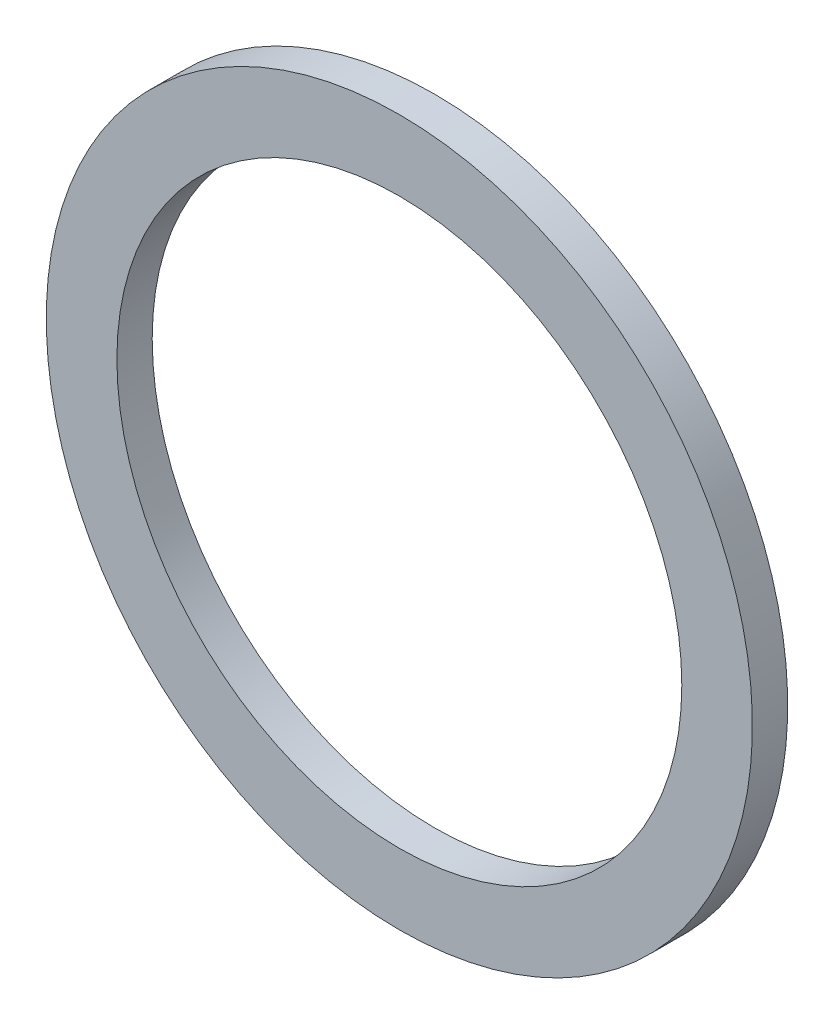
ISO-10303-21;
HEADER;
FILE_DESCRIPTION(('STEP AP214'),'2;1');
FILE_NAME('part.step','',(''),(''),'','','');
FILE_SCHEMA(('AUTOMOTIVE_DESIGN { 1 0 10303 214 1 1 1 1 }'));
ENDSEC;
DATA;
#1=APPLICATION_CONTEXT('core data for automotive mechanical design processes');
#2=APPLICATION_PROTOCOL_DEFINITION('international standard','automotive_design',2000,#1);
#3=PRODUCT_CONTEXT('',#1,'mechanical');
#4=PRODUCT('Part','Part','',(#3));
#5=PRODUCT_RELATED_PRODUCT_CATEGORY('part','',(#4));
#6=PRODUCT_DEFINITION_FORMATION('','',#4);
#7=PRODUCT_DEFINITION_CONTEXT('part definition',#1,'design');
#8=PRODUCT_DEFINITION('design','',#6,#7);
#9=PRODUCT_DEFINITION_SHAPE('','',#8);
#10=(LENGTH_UNIT() NAMED_UNIT(*) SI_UNIT(.MILLI.,.METRE.));
#11=(NAMED_UNIT(*) PLANE_ANGLE_UNIT() SI_UNIT($,.RADIAN.));
#12=(NAMED_UNIT(*) SI_UNIT($,.STERADIAN.) SOLID_ANGLE_UNIT());
#13=UNCERTAINTY_MEASURE_WITH_UNIT(LENGTH_MEASURE(1.E-05),#10,'distance_accuracy_value','');
#14=(GEOMETRIC_REPRESENTATION_CONTEXT(3) GLOBAL_UNCERTAINTY_ASSIGNED_CONTEXT((#13)) GLOBAL_UNIT_ASSIGNED_CONTEXT((#10,
#11,#12)) REPRESENTATION_CONTEXT('',''));
#15=CARTESIAN_POINT('',(0.,0.,0.));
#16=DIRECTION('',(0.,0.,1.));
#17=DIRECTION('',(1.,0.,0.));
#18=AXIS2_PLACEMENT_3D('',#15,#16,#17);
#19=CARTESIAN_POINT('',(0.,0.,0.));
#20=DIRECTION('',(0.,0.,-1.));
#21=DIRECTION('',(0.,1.,0.));
#22=AXIS2_PLACEMENT_3D('',#19,#20,#21);
#23=PLANE('',#22);
#24=CARTESIAN_POINT('',(0.,0.,0.));
#25=DIRECTION('',(0.,0.,-1.));
#26=DIRECTION('',(0.,1.,0.));
#27=AXIS2_PLACEMENT_3D('',#24,#25,#26);
#28=CIRCLE('',#27,4.);
#29=CARTESIAN_POINT('',(0.,4.,0.));
#30=VERTEX_POINT('',#29);
#31=EDGE_CURVE('E46',#30,#30,#28,.T.);
#32=ORIENTED_EDGE('',*,*,#31,.F.);
#33=EDGE_LOOP('',(#32));
#34=FACE_BOUND('',#33,.T.);
#35=CARTESIAN_POINT('',(0.,0.,0.));
#36=DIRECTION('',(0.,0.,-1.));
#37=DIRECTION('',(0.,1.,0.));
#38=AXIS2_PLACEMENT_3D('',#35,#36,#37);
#39=CIRCLE('',#38,5.);
#40=CARTESIAN_POINT('',(0.,5.,0.));
#41=VERTEX_POINT('',#40);
#42=EDGE_CURVE('E10',#41,#41,#39,.T.);
#43=ORIENTED_EDGE('',*,*,#42,.T.);
#44=EDGE_LOOP('',(#43));
#45=FACE_BOUND('',#44,.T.);
#46=ADVANCED_FACE('F32',(#34,#45),#23,.T.);
#47=CARTESIAN_POINT('',(0.,0.,0.));
#48=DIRECTION('',(0.,0.,-1.));
#49=DIRECTION('',(0.,1.,0.));
#50=AXIS2_PLACEMENT_3D('',#47,#48,#49);
#51=CYLINDRICAL_SURFACE('',#50,5.);
#52=CARTESIAN_POINT('',(0.,0.,0.499999999999999));
#53=DIRECTION('',(0.,0.,-1.));
#54=DIRECTION('',(0.,1.,0.));
#55=AXIS2_PLACEMENT_3D('',#52,#53,#54);
#56=CIRCLE('',#55,5.);
#57=CARTESIAN_POINT('',(0.,5.,0.5));
#58=VERTEX_POINT('',#57);
#59=EDGE_CURVE('E38',#58,#58,#56,.T.);
#60=ORIENTED_EDGE('',*,*,#59,.T.);
#61=EDGE_LOOP('',(#60));
#62=FACE_BOUND('',#61,.T.);
#63=ORIENTED_EDGE('',*,*,#42,.F.);
#64=EDGE_LOOP('',(#63));
#65=FACE_BOUND('',#64,.T.);
#66=ADVANCED_FACE('F55',(#62,#65),#51,.T.);
#67=CARTESIAN_POINT('',(0.,0.,0.5));
#68=DIRECTION('',(0.,0.,1.));
#69=DIRECTION('',(0.,-1.,0.));
#70=AXIS2_PLACEMENT_3D('',#67,#68,#69);
#71=PLANE('',#70);
#72=CARTESIAN_POINT('',(0.,0.,0.499999999999999));
#73=DIRECTION('',(0.,0.,-1.));
#74=DIRECTION('',(0.,1.,0.));
#75=AXIS2_PLACEMENT_3D('',#72,#73,#74);
#76=CIRCLE('',#75,4.);
#77=CARTESIAN_POINT('',(0.,4.,0.5));
#78=VERTEX_POINT('',#77);
#79=EDGE_CURVE('E42',#78,#78,#76,.T.);
#80=ORIENTED_EDGE('',*,*,#79,.T.);
#81=EDGE_LOOP('',(#80));
#82=FACE_BOUND('',#81,.T.);
#83=ORIENTED_EDGE('',*,*,#59,.F.);
#84=EDGE_LOOP('',(#83));
#85=FACE_BOUND('',#84,.T.);
#86=ADVANCED_FACE('F59',(#82,#85),#71,.T.);
#87=CARTESIAN_POINT('',(0.,0.,0.));
#88=DIRECTION('',(0.,0.,-1.));
#89=DIRECTION('',(0.,1.,0.));
#90=AXIS2_PLACEMENT_3D('',#87,#88,#89);
#91=CYLINDRICAL_SURFACE('',#90,4.);
#92=ORIENTED_EDGE('',*,*,#79,.F.);
#93=EDGE_LOOP('',(#92));
#94=FACE_BOUND('',#93,.T.);
#95=ORIENTED_EDGE('',*,*,#31,.T.);
#96=EDGE_LOOP('',(#95));
#97=FACE_BOUND('',#96,.T.);
#98=ADVANCED_FACE('F52',(#94,#97),#91,.F.);
#99=CLOSED_SHELL('',(#46,#66,#86,#98));
#100=MANIFOLD_SOLID_BREP('B2',#99);
#101=ADVANCED_BREP_SHAPE_REPRESENTATION('',(#18,#100),#14);
#102=SHAPE_DEFINITION_REPRESENTATION(#9,#101);
ENDSEC;
END-ISO-10303-21;
